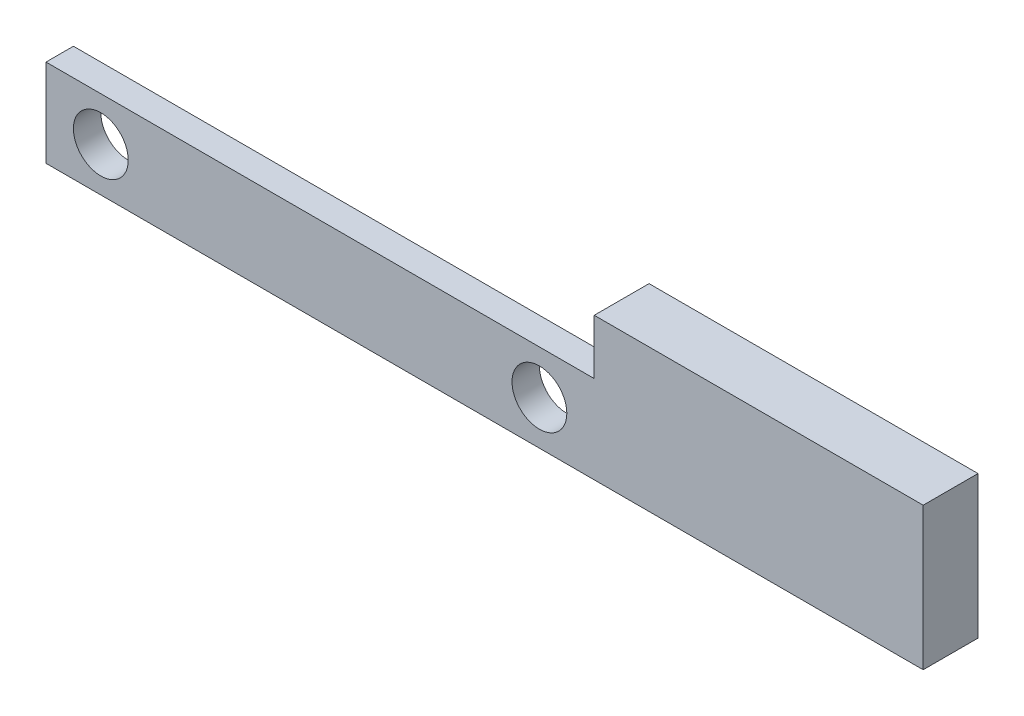
ISO-10303-21;
HEADER;
FILE_DESCRIPTION(('STEP AP214'),'2;1');
FILE_NAME('part.step','',(''),(''),'','','');
FILE_SCHEMA(('AUTOMOTIVE_DESIGN { 1 0 10303 214 1 1 1 1 }'));
ENDSEC;
DATA;
#1=APPLICATION_CONTEXT('core data for automotive mechanical design processes');
#2=APPLICATION_PROTOCOL_DEFINITION('international standard','automotive_design',2000,#1);
#3=PRODUCT_CONTEXT('',#1,'mechanical');
#4=PRODUCT('Part','Part','',(#3));
#5=PRODUCT_RELATED_PRODUCT_CATEGORY('part','',(#4));
#6=PRODUCT_DEFINITION_FORMATION('','',#4);
#7=PRODUCT_DEFINITION_CONTEXT('part definition',#1,'design');
#8=PRODUCT_DEFINITION('design','',#6,#7);
#9=PRODUCT_DEFINITION_SHAPE('','',#8);
#10=(LENGTH_UNIT() NAMED_UNIT(*) SI_UNIT(.MILLI.,.METRE.));
#11=(NAMED_UNIT(*) PLANE_ANGLE_UNIT() SI_UNIT($,.RADIAN.));
#12=(NAMED_UNIT(*) SI_UNIT($,.STERADIAN.) SOLID_ANGLE_UNIT());
#13=UNCERTAINTY_MEASURE_WITH_UNIT(LENGTH_MEASURE(1.E-05),#10,'distance_accuracy_value','');
#14=(GEOMETRIC_REPRESENTATION_CONTEXT(3) GLOBAL_UNCERTAINTY_ASSIGNED_CONTEXT((#13)) GLOBAL_UNIT_ASSIGNED_CONTEXT((#10,
#11,#12)) REPRESENTATION_CONTEXT('',''));
#15=CARTESIAN_POINT('',(0.,0.,0.));
#16=DIRECTION('',(0.,0.,1.));
#17=DIRECTION('',(1.,0.,0.));
#18=AXIS2_PLACEMENT_3D('',#15,#16,#17);
#19=CARTESIAN_POINT('',(0.,8.,5.));
#20=DIRECTION('',(0.,-1.,0.));
#21=DIRECTION('',(0.,0.,-1.));
#22=AXIS2_PLACEMENT_3D('',#19,#20,#21);
#23=PLANE('',#22);
#24=DIRECTION('',(1.,0.,0.));
#25=VECTOR('',#24,1.);
#26=CARTESIAN_POINT('',(0.,8.,2.5));
#27=LINE('',#26,#25);
#28=CARTESIAN_POINT('',(0.,8.,2.5));
#29=VERTEX_POINT('',#28);
#30=CARTESIAN_POINT('',(50.,8.,2.5));
#31=VERTEX_POINT('',#30);
#32=EDGE_CURVE('E211',#29,#31,#27,.T.);
#33=ORIENTED_EDGE('',*,*,#32,.F.);
#34=DIRECTION('',(0.,0.,-1.));
#35=VECTOR('',#34,1.);
#36=CARTESIAN_POINT('',(0.,8.,5.));
#37=LINE('',#36,#35);
#38=CARTESIAN_POINT('',(0.,8.,5.));
#39=VERTEX_POINT('',#38);
#40=EDGE_CURVE('E111',#39,#29,#37,.T.);
#41=ORIENTED_EDGE('',*,*,#40,.F.);
#42=DIRECTION('',(-1.,0.,0.));
#43=VECTOR('',#42,1.);
#44=CARTESIAN_POINT('',(0.,8.,5.));
#45=LINE('',#44,#43);
#46=CARTESIAN_POINT('',(50.,8.,5.));
#47=VERTEX_POINT('',#46);
#48=EDGE_CURVE('E92',#47,#39,#45,.T.);
#49=ORIENTED_EDGE('',*,*,#48,.F.);
#50=DIRECTION('',(0.,0.,-1.));
#51=VECTOR('',#50,1.);
#52=CARTESIAN_POINT('',(50.,8.,5.));
#53=LINE('',#52,#51);
#54=EDGE_CURVE('E100',#47,#31,#53,.T.);
#55=ORIENTED_EDGE('',*,*,#54,.T.);
#56=EDGE_LOOP('',(#33,#41,#49,#55));
#57=FACE_BOUND('',#56,.T.);
#58=ADVANCED_FACE('F33',(#57),#23,.F.);
#59=CARTESIAN_POINT('',(0.,0.,5.));
#60=DIRECTION('',(1.,0.,0.));
#61=DIRECTION('',(0.,0.,-1.));
#62=AXIS2_PLACEMENT_3D('',#59,#60,#61);
#63=PLANE('',#62);
#64=DIRECTION('',(0.,1.,0.));
#65=VECTOR('',#64,1.);
#66=CARTESIAN_POINT('',(0.,0.,2.5));
#67=LINE('',#66,#65);
#68=CARTESIAN_POINT('',(0.,0.,2.5));
#69=VERTEX_POINT('',#68);
#70=EDGE_CURVE('E205',#69,#29,#67,.T.);
#71=ORIENTED_EDGE('',*,*,#70,.F.);
#72=DIRECTION('',(0.,0.,-1.));
#73=VECTOR('',#72,1.);
#74=CARTESIAN_POINT('',(0.,0.,5.));
#75=LINE('',#74,#73);
#76=CARTESIAN_POINT('',(0.,0.,5.));
#77=VERTEX_POINT('',#76);
#78=EDGE_CURVE('E115',#77,#69,#75,.T.);
#79=ORIENTED_EDGE('',*,*,#78,.F.);
#80=DIRECTION('',(0.,-1.,0.));
#81=VECTOR('',#80,1.);
#82=CARTESIAN_POINT('',(0.,0.,5.));
#83=LINE('',#82,#81);
#84=EDGE_CURVE('E51',#39,#77,#83,.T.);
#85=ORIENTED_EDGE('',*,*,#84,.F.);
#86=ORIENTED_EDGE('',*,*,#40,.T.);
#87=EDGE_LOOP('',(#71,#79,#85,#86));
#88=FACE_BOUND('',#87,.T.);
#89=ADVANCED_FACE('F169',(#88),#63,.F.);
#90=CARTESIAN_POINT('',(45.,4.,0.));
#91=DIRECTION('',(0.,0.,1.));
#92=DIRECTION('',(1.,0.,0.));
#93=AXIS2_PLACEMENT_3D('',#90,#91,#92);
#94=CYLINDRICAL_SURFACE('',#93,2.5);
#95=CARTESIAN_POINT('',(45.,4.,5.));
#96=DIRECTION('',(0.,0.,1.));
#97=DIRECTION('',(1.,0.,0.));
#98=AXIS2_PLACEMENT_3D('',#95,#96,#97);
#99=CIRCLE('',#98,2.5);
#100=CARTESIAN_POINT('',(47.5,4.,5.));
#101=VERTEX_POINT('',#100);
#102=EDGE_CURVE('E153',#101,#101,#99,.T.);
#103=ORIENTED_EDGE('',*,*,#102,.T.);
#104=EDGE_LOOP('',(#103));
#105=FACE_BOUND('',#104,.T.);
#106=CARTESIAN_POINT('',(45.,4.,2.5));
#107=DIRECTION('',(0.,0.,-1.));
#108=DIRECTION('',(-1.,0.,0.));
#109=AXIS2_PLACEMENT_3D('',#106,#107,#108);
#110=CIRCLE('',#109,2.5);
#111=CARTESIAN_POINT('',(42.5,4.,2.5));
#112=VERTEX_POINT('',#111);
#113=EDGE_CURVE('E147',#112,#112,#110,.F.);
#114=ORIENTED_EDGE('',*,*,#113,.F.);
#115=EDGE_LOOP('',(#114));
#116=FACE_BOUND('',#115,.T.);
#117=ADVANCED_FACE('F174',(#105,#116),#94,.F.);
#118=CARTESIAN_POINT('',(5.,4.,0.));
#119=DIRECTION('',(0.,0.,1.));
#120=DIRECTION('',(1.,0.,0.));
#121=AXIS2_PLACEMENT_3D('',#118,#119,#120);
#122=CYLINDRICAL_SURFACE('',#121,2.5);
#123=CARTESIAN_POINT('',(5.,4.,5.));
#124=DIRECTION('',(0.,0.,1.));
#125=DIRECTION('',(1.,0.,0.));
#126=AXIS2_PLACEMENT_3D('',#123,#124,#125);
#127=CIRCLE('',#126,2.5);
#128=CARTESIAN_POINT('',(7.5,4.,5.));
#129=VERTEX_POINT('',#128);
#130=EDGE_CURVE('E121',#129,#129,#127,.T.);
#131=ORIENTED_EDGE('',*,*,#130,.T.);
#132=EDGE_LOOP('',(#131));
#133=FACE_BOUND('',#132,.T.);
#134=CARTESIAN_POINT('',(5.,4.,2.5));
#135=DIRECTION('',(0.,0.,-1.));
#136=DIRECTION('',(-1.,0.,0.));
#137=AXIS2_PLACEMENT_3D('',#134,#135,#136);
#138=CIRCLE('',#137,2.5);
#139=CARTESIAN_POINT('',(2.5,4.,2.5));
#140=VERTEX_POINT('',#139);
#141=EDGE_CURVE('E37',#140,#140,#138,.F.);
#142=ORIENTED_EDGE('',*,*,#141,.F.);
#143=EDGE_LOOP('',(#142));
#144=FACE_BOUND('',#143,.T.);
#145=ADVANCED_FACE('F167',(#133,#144),#122,.F.);
#146=CARTESIAN_POINT('',(80.,0.,5.));
#147=DIRECTION('',(0.,1.,0.));
#148=DIRECTION('',(-1.,0.,0.));
#149=AXIS2_PLACEMENT_3D('',#146,#147,#148);
#150=PLANE('',#149);
#151=DIRECTION('',(-1.,0.,0.));
#152=VECTOR('',#151,1.);
#153=CARTESIAN_POINT('',(0.,0.,2.5));
#154=LINE('',#153,#152);
#155=CARTESIAN_POINT('',(50.,0.,2.5));
#156=VERTEX_POINT('',#155);
#157=EDGE_CURVE('E144',#156,#69,#154,.T.);
#158=ORIENTED_EDGE('',*,*,#157,.F.);
#159=DIRECTION('',(0.,0.,-1.));
#160=VECTOR('',#159,1.);
#161=CARTESIAN_POINT('',(50.,0.,2.5));
#162=LINE('',#161,#160);
#163=CARTESIAN_POINT('',(50.,0.,0.));
#164=VERTEX_POINT('',#163);
#165=EDGE_CURVE('E138',#156,#164,#162,.T.);
#166=ORIENTED_EDGE('',*,*,#165,.T.);
#167=DIRECTION('',(1.,0.,0.));
#168=VECTOR('',#167,1.);
#169=CARTESIAN_POINT('',(80.,0.,0.));
#170=LINE('',#169,#168);
#171=CARTESIAN_POINT('',(80.,0.,0.));
#172=VERTEX_POINT('',#171);
#173=EDGE_CURVE('E119',#164,#172,#170,.T.);
#174=ORIENTED_EDGE('',*,*,#173,.T.);
#175=DIRECTION('',(0.,0.,-1.));
#176=VECTOR('',#175,1.);
#177=CARTESIAN_POINT('',(80.,0.,5.));
#178=LINE('',#177,#176);
#179=CARTESIAN_POINT('',(80.,0.,5.));
#180=VERTEX_POINT('',#179);
#181=EDGE_CURVE('E11',#180,#172,#178,.T.);
#182=ORIENTED_EDGE('',*,*,#181,.F.);
#183=DIRECTION('',(1.,0.,0.));
#184=VECTOR('',#183,1.);
#185=CARTESIAN_POINT('',(80.,0.,5.));
#186=LINE('',#185,#184);
#187=EDGE_CURVE('E126',#77,#180,#186,.T.);
#188=ORIENTED_EDGE('',*,*,#187,.F.);
#189=ORIENTED_EDGE('',*,*,#78,.T.);
#190=EDGE_LOOP('',(#158,#166,#174,#182,#188,#189));
#191=FACE_BOUND('',#190,.T.);
#192=ADVANCED_FACE('F35',(#191),#150,.F.);
#193=CARTESIAN_POINT('',(80.,13.,5.));
#194=DIRECTION('',(-1.,0.,0.));
#195=DIRECTION('',(0.,0.,1.));
#196=AXIS2_PLACEMENT_3D('',#193,#194,#195);
#197=PLANE('',#196);
#198=DIRECTION('',(0.,1.,0.));
#199=VECTOR('',#198,1.);
#200=CARTESIAN_POINT('',(80.,13.,0.));
#201=LINE('',#200,#199);
#202=CARTESIAN_POINT('',(80.,13.,0.));
#203=VERTEX_POINT('',#202);
#204=EDGE_CURVE('E65',#172,#203,#201,.T.);
#205=ORIENTED_EDGE('',*,*,#204,.T.);
#206=DIRECTION('',(0.,0.,-1.));
#207=VECTOR('',#206,1.);
#208=CARTESIAN_POINT('',(80.,13.,5.));
#209=LINE('',#208,#207);
#210=CARTESIAN_POINT('',(80.,13.,5.));
#211=VERTEX_POINT('',#210);
#212=EDGE_CURVE('E43',#211,#203,#209,.T.);
#213=ORIENTED_EDGE('',*,*,#212,.F.);
#214=DIRECTION('',(0.,1.,0.));
#215=VECTOR('',#214,1.);
#216=CARTESIAN_POINT('',(80.,13.,5.));
#217=LINE('',#216,#215);
#218=EDGE_CURVE('E78',#180,#211,#217,.T.);
#219=ORIENTED_EDGE('',*,*,#218,.F.);
#220=ORIENTED_EDGE('',*,*,#181,.T.);
#221=EDGE_LOOP('',(#205,#213,#219,#220));
#222=FACE_BOUND('',#221,.T.);
#223=ADVANCED_FACE('F160',(#222),#197,.F.);
#224=CARTESIAN_POINT('',(50.,13.,5.));
#225=DIRECTION('',(0.,-1.,0.));
#226=DIRECTION('',(0.,0.,-1.));
#227=AXIS2_PLACEMENT_3D('',#224,#225,#226);
#228=PLANE('',#227);
#229=DIRECTION('',(-1.,0.,0.));
#230=VECTOR('',#229,1.);
#231=CARTESIAN_POINT('',(50.,13.,0.));
#232=LINE('',#231,#230);
#233=CARTESIAN_POINT('',(50.,13.,0.));
#234=VERTEX_POINT('',#233);
#235=EDGE_CURVE('E72',#203,#234,#232,.T.);
#236=ORIENTED_EDGE('',*,*,#235,.T.);
#237=DIRECTION('',(0.,0.,-1.));
#238=VECTOR('',#237,1.);
#239=CARTESIAN_POINT('',(50.,13.,5.));
#240=LINE('',#239,#238);
#241=CARTESIAN_POINT('',(50.,13.,5.));
#242=VERTEX_POINT('',#241);
#243=EDGE_CURVE('E110',#242,#234,#240,.T.);
#244=ORIENTED_EDGE('',*,*,#243,.F.);
#245=DIRECTION('',(-1.,0.,0.));
#246=VECTOR('',#245,1.);
#247=CARTESIAN_POINT('',(50.,13.,5.));
#248=LINE('',#247,#246);
#249=EDGE_CURVE('E95',#211,#242,#248,.T.);
#250=ORIENTED_EDGE('',*,*,#249,.F.);
#251=ORIENTED_EDGE('',*,*,#212,.T.);
#252=EDGE_LOOP('',(#236,#244,#250,#251));
#253=FACE_BOUND('',#252,.T.);
#254=ADVANCED_FACE('F131',(#253),#228,.F.);
#255=CARTESIAN_POINT('',(50.,8.,5.));
#256=DIRECTION('',(1.,0.,0.));
#257=DIRECTION('',(0.,0.,-1.));
#258=AXIS2_PLACEMENT_3D('',#255,#256,#257);
#259=PLANE('',#258);
#260=DIRECTION('',(0.,-1.,0.));
#261=VECTOR('',#260,1.);
#262=CARTESIAN_POINT('',(50.,8.,0.));
#263=LINE('',#262,#261);
#264=EDGE_CURVE('E124',#234,#164,#263,.T.);
#265=ORIENTED_EDGE('',*,*,#264,.T.);
#266=ORIENTED_EDGE('',*,*,#165,.F.);
#267=DIRECTION('',(0.,-1.,0.));
#268=VECTOR('',#267,1.);
#269=CARTESIAN_POINT('',(50.,0.,2.5));
#270=LINE('',#269,#268);
#271=EDGE_CURVE('E106',#31,#156,#270,.T.);
#272=ORIENTED_EDGE('',*,*,#271,.F.);
#273=ORIENTED_EDGE('',*,*,#54,.F.);
#274=DIRECTION('',(0.,-1.,0.));
#275=VECTOR('',#274,1.);
#276=CARTESIAN_POINT('',(50.,8.,5.));
#277=LINE('',#276,#275);
#278=EDGE_CURVE('E88',#242,#47,#277,.T.);
#279=ORIENTED_EDGE('',*,*,#278,.F.);
#280=ORIENTED_EDGE('',*,*,#243,.T.);
#281=EDGE_LOOP('',(#265,#266,#272,#273,#279,#280));
#282=FACE_BOUND('',#281,.T.);
#283=ADVANCED_FACE('F102',(#282),#259,.F.);
#284=CARTESIAN_POINT('',(0.,0.,5.));
#285=DIRECTION('',(0.,0.,-1.));
#286=DIRECTION('',(-1.,0.,0.));
#287=AXIS2_PLACEMENT_3D('',#284,#285,#286);
#288=PLANE('',#287);
#289=ORIENTED_EDGE('',*,*,#130,.F.);
#290=EDGE_LOOP('',(#289));
#291=FACE_BOUND('',#290,.T.);
#292=ORIENTED_EDGE('',*,*,#102,.F.);
#293=EDGE_LOOP('',(#292));
#294=FACE_BOUND('',#293,.T.);
#295=ORIENTED_EDGE('',*,*,#187,.T.);
#296=ORIENTED_EDGE('',*,*,#218,.T.);
#297=ORIENTED_EDGE('',*,*,#249,.T.);
#298=ORIENTED_EDGE('',*,*,#278,.T.);
#299=ORIENTED_EDGE('',*,*,#48,.T.);
#300=ORIENTED_EDGE('',*,*,#84,.T.);
#301=EDGE_LOOP('',(#295,#296,#297,#298,#299,#300));
#302=FACE_BOUND('',#301,.T.);
#303=ADVANCED_FACE('F90',(#291,#294,#302),#288,.F.);
#304=CARTESIAN_POINT('',(0.,0.,0.));
#305=DIRECTION('',(0.,0.,-1.));
#306=DIRECTION('',(-1.,0.,0.));
#307=AXIS2_PLACEMENT_3D('',#304,#305,#306);
#308=PLANE('',#307);
#309=ORIENTED_EDGE('',*,*,#173,.F.);
#310=ORIENTED_EDGE('',*,*,#264,.F.);
#311=ORIENTED_EDGE('',*,*,#235,.F.);
#312=ORIENTED_EDGE('',*,*,#204,.F.);
#313=EDGE_LOOP('',(#309,#310,#311,#312));
#314=FACE_BOUND('',#313,.T.);
#315=ADVANCED_FACE('F135',(#314),#308,.T.);
#316=CARTESIAN_POINT('',(0.,0.,2.5));
#317=DIRECTION('',(0.,0.,-1.));
#318=DIRECTION('',(-1.,0.,0.));
#319=AXIS2_PLACEMENT_3D('',#316,#317,#318);
#320=PLANE('',#319);
#321=ORIENTED_EDGE('',*,*,#70,.T.);
#322=ORIENTED_EDGE('',*,*,#32,.T.);
#323=ORIENTED_EDGE('',*,*,#271,.T.);
#324=ORIENTED_EDGE('',*,*,#157,.T.);
#325=EDGE_LOOP('',(#321,#322,#323,#324));
#326=FACE_BOUND('',#325,.T.);
#327=ORIENTED_EDGE('',*,*,#141,.T.);
#328=EDGE_LOOP('',(#327));
#329=FACE_BOUND('',#328,.T.);
#330=ORIENTED_EDGE('',*,*,#113,.T.);
#331=EDGE_LOOP('',(#330));
#332=FACE_BOUND('',#331,.T.);
#333=ADVANCED_FACE('F188',(#326,#329,#332),#320,.T.);
#334=CLOSED_SHELL('',(#58,#89,#117,#145,#192,#223,#254,#283,#303,#315,#333));
#335=MANIFOLD_SOLID_BREP('B2',#334);
#336=ADVANCED_BREP_SHAPE_REPRESENTATION('',(#18,#335),#14);
#337=SHAPE_DEFINITION_REPRESENTATION(#9,#336);
ENDSEC;
END-ISO-10303-21;
